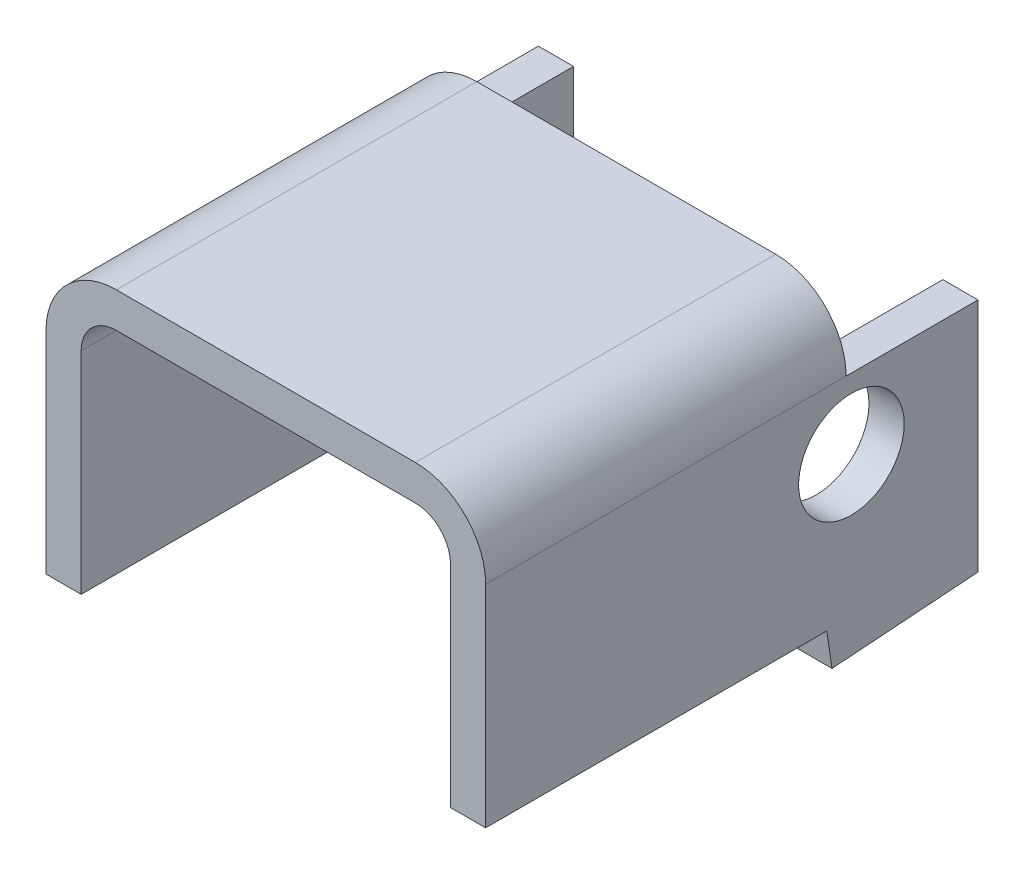
ISO-10303-21;
HEADER;
FILE_DESCRIPTION(('STEP AP214'),'2;1');
FILE_NAME('part.step','',(''),(''),'','','');
FILE_SCHEMA(('AUTOMOTIVE_DESIGN { 1 0 10303 214 1 1 1 1 }'));
ENDSEC;
DATA;
#1=APPLICATION_CONTEXT('core data for automotive mechanical design processes');
#2=APPLICATION_PROTOCOL_DEFINITION('international standard','automotive_design',2000,#1);
#3=PRODUCT_CONTEXT('',#1,'mechanical');
#4=PRODUCT('Part','Part','',(#3));
#5=PRODUCT_RELATED_PRODUCT_CATEGORY('part','',(#4));
#6=PRODUCT_DEFINITION_FORMATION('','',#4);
#7=PRODUCT_DEFINITION_CONTEXT('part definition',#1,'design');
#8=PRODUCT_DEFINITION('design','',#6,#7);
#9=PRODUCT_DEFINITION_SHAPE('','',#8);
#10=(LENGTH_UNIT() NAMED_UNIT(*) SI_UNIT(.MILLI.,.METRE.));
#11=(NAMED_UNIT(*) PLANE_ANGLE_UNIT() SI_UNIT($,.RADIAN.));
#12=(NAMED_UNIT(*) SI_UNIT($,.STERADIAN.) SOLID_ANGLE_UNIT());
#13=UNCERTAINTY_MEASURE_WITH_UNIT(LENGTH_MEASURE(1.E-05),#10,'distance_accuracy_value','');
#14=(GEOMETRIC_REPRESENTATION_CONTEXT(3) GLOBAL_UNCERTAINTY_ASSIGNED_CONTEXT((#13)) GLOBAL_UNIT_ASSIGNED_CONTEXT((#10,
#11,#12)) REPRESENTATION_CONTEXT('',''));
#15=CARTESIAN_POINT('',(0.,0.,0.));
#16=DIRECTION('',(0.,0.,1.));
#17=DIRECTION('',(1.,0.,0.));
#18=AXIS2_PLACEMENT_3D('',#15,#16,#17);
#19=CARTESIAN_POINT('',(-0.5,6.,0.));
#20=DIRECTION('',(0.,1.,0.));
#21=DIRECTION('',(0.,0.,1.));
#22=AXIS2_PLACEMENT_3D('',#19,#20,#21);
#23=PLANE('',#22);
#24=DIRECTION('',(0.,0.,1.));
#25=VECTOR('',#24,1.);
#26=CARTESIAN_POINT('',(-0.5,6.,0.));
#27=LINE('',#26,#25);
#28=CARTESIAN_POINT('',(-0.5,6.,-14.));
#29=VERTEX_POINT('',#28);
#30=CARTESIAN_POINT('',(-0.5,6.,-10.25));
#31=VERTEX_POINT('',#30);
#32=EDGE_CURVE('E124',#29,#31,#27,.T.);
#33=ORIENTED_EDGE('',*,*,#32,.T.);
#34=DIRECTION('',(1.,0.,0.));
#35=VECTOR('',#34,1.);
#36=CARTESIAN_POINT('',(0.5,6.,-10.25));
#37=LINE('',#36,#35);
#38=CARTESIAN_POINT('',(0.5,6.,-10.25));
#39=VERTEX_POINT('',#38);
#40=EDGE_CURVE('E246',#31,#39,#37,.T.);
#41=ORIENTED_EDGE('',*,*,#40,.T.);
#42=DIRECTION('',(0.,0.,1.));
#43=VECTOR('',#42,1.);
#44=CARTESIAN_POINT('',(0.5,6.,0.));
#45=LINE('',#44,#43);
#46=CARTESIAN_POINT('',(0.5,6.,-14.));
#47=VERTEX_POINT('',#46);
#48=EDGE_CURVE('E155',#47,#39,#45,.T.);
#49=ORIENTED_EDGE('',*,*,#48,.F.);
#50=DIRECTION('',(1.,0.,0.));
#51=VECTOR('',#50,1.);
#52=CARTESIAN_POINT('',(-0.5,6.,-14.));
#53=LINE('',#52,#51);
#54=EDGE_CURVE('E50',#29,#47,#53,.T.);
#55=ORIENTED_EDGE('',*,*,#54,.F.);
#56=EDGE_LOOP('',(#33,#41,#49,#55));
#57=FACE_BOUND('',#56,.T.);
#58=ADVANCED_FACE('F39',(#57),#23,.T.);
#59=CARTESIAN_POINT('',(-0.5,0.,-9.7));
#60=DIRECTION('',(0.,-1.,0.));
#61=DIRECTION('',(0.,0.,-1.));
#62=AXIS2_PLACEMENT_3D('',#59,#60,#61);
#63=PLANE('',#62);
#64=DIRECTION('',(0.,0.,-1.));
#65=VECTOR('',#64,1.);
#66=CARTESIAN_POINT('',(0.5,0.,-9.7));
#67=LINE('',#66,#65);
#68=CARTESIAN_POINT('',(0.5,0.,0.));
#69=VERTEX_POINT('',#68);
#70=CARTESIAN_POINT('',(0.5,0.,-9.7));
#71=VERTEX_POINT('',#70);
#72=EDGE_CURVE('E141',#69,#71,#67,.T.);
#73=ORIENTED_EDGE('',*,*,#72,.F.);
#74=DIRECTION('',(1.,0.,0.));
#75=VECTOR('',#74,1.);
#76=CARTESIAN_POINT('',(-0.5,0.,0.));
#77=LINE('',#76,#75);
#78=CARTESIAN_POINT('',(-0.5,0.,0.));
#79=VERTEX_POINT('',#78);
#80=EDGE_CURVE('E11',#79,#69,#77,.T.);
#81=ORIENTED_EDGE('',*,*,#80,.F.);
#82=DIRECTION('',(0.,0.,-1.));
#83=VECTOR('',#82,1.);
#84=CARTESIAN_POINT('',(-0.5,0.,-9.7));
#85=LINE('',#84,#83);
#86=CARTESIAN_POINT('',(-0.5,0.,-9.7));
#87=VERTEX_POINT('',#86);
#88=EDGE_CURVE('E132',#79,#87,#85,.T.);
#89=ORIENTED_EDGE('',*,*,#88,.T.);
#90=DIRECTION('',(1.,0.,0.));
#91=VECTOR('',#90,1.);
#92=CARTESIAN_POINT('',(-0.5,0.,-9.7));
#93=LINE('',#92,#91);
#94=EDGE_CURVE('E43',#87,#71,#93,.T.);
#95=ORIENTED_EDGE('',*,*,#94,.T.);
#96=EDGE_LOOP('',(#73,#81,#89,#95));
#97=FACE_BOUND('',#96,.T.);
#98=ADVANCED_FACE('F41',(#97),#63,.T.);
#99=CARTESIAN_POINT('',(-0.5,0.,0.));
#100=DIRECTION('',(0.,0.,1.));
#101=DIRECTION('',(1.,0.,0.));
#102=AXIS2_PLACEMENT_3D('',#99,#100,#101);
#103=PLANE('',#102);
#104=DIRECTION('',(0.,-1.,0.));
#105=VECTOR('',#104,1.);
#106=CARTESIAN_POINT('',(0.5,0.,0.));
#107=LINE('',#106,#105);
#108=CARTESIAN_POINT('',(0.5,6.,0.));
#109=VERTEX_POINT('',#108);
#110=EDGE_CURVE('E159',#109,#69,#107,.T.);
#111=ORIENTED_EDGE('',*,*,#110,.F.);
#112=CARTESIAN_POINT('',(-1.5,6.,0.));
#113=DIRECTION('',(0.,0.,1.));
#114=DIRECTION('',(-1.,0.,0.));
#115=AXIS2_PLACEMENT_3D('',#112,#113,#114);
#116=CIRCLE('',#115,2.);
#117=CARTESIAN_POINT('',(-1.5,8.,0.));
#118=VERTEX_POINT('',#117);
#119=EDGE_CURVE('E82',#109,#118,#116,.T.);
#120=ORIENTED_EDGE('',*,*,#119,.T.);
#121=DIRECTION('',(-1.,0.,0.));
#122=VECTOR('',#121,1.);
#123=CARTESIAN_POINT('',(-10.,8.,0.));
#124=LINE('',#123,#122);
#125=CARTESIAN_POINT('',(-10.,8.,0.));
#126=VERTEX_POINT('',#125);
#127=EDGE_CURVE('E176',#118,#126,#124,.T.);
#128=ORIENTED_EDGE('',*,*,#127,.T.);
#129=CARTESIAN_POINT('',(-10.,6.,0.));
#130=DIRECTION('',(0.,0.,1.));
#131=DIRECTION('',(-1.,0.,0.));
#132=AXIS2_PLACEMENT_3D('',#129,#130,#131);
#133=CIRCLE('',#132,2.);
#134=CARTESIAN_POINT('',(-12.,6.,0.));
#135=VERTEX_POINT('',#134);
#136=EDGE_CURVE('E184',#126,#135,#133,.T.);
#137=ORIENTED_EDGE('',*,*,#136,.T.);
#138=DIRECTION('',(0.,1.,0.));
#139=VECTOR('',#138,1.);
#140=CARTESIAN_POINT('',(-12.,6.,0.));
#141=LINE('',#140,#139);
#142=CARTESIAN_POINT('',(-12.,0.,0.));
#143=VERTEX_POINT('',#142);
#144=EDGE_CURVE('E336',#143,#135,#141,.T.);
#145=ORIENTED_EDGE('',*,*,#144,.F.);
#146=DIRECTION('',(-1.,0.,0.));
#147=VECTOR('',#146,1.);
#148=CARTESIAN_POINT('',(-11.,0.,0.));
#149=LINE('',#148,#147);
#150=CARTESIAN_POINT('',(-11.,0.,0.));
#151=VERTEX_POINT('',#150);
#152=EDGE_CURVE('E266',#151,#143,#149,.T.);
#153=ORIENTED_EDGE('',*,*,#152,.F.);
#154=DIRECTION('',(0.,1.,0.));
#155=VECTOR('',#154,1.);
#156=CARTESIAN_POINT('',(-11.,6.,0.));
#157=LINE('',#156,#155);
#158=CARTESIAN_POINT('',(-11.,6.,0.));
#159=VERTEX_POINT('',#158);
#160=EDGE_CURVE('E397',#151,#159,#157,.T.);
#161=ORIENTED_EDGE('',*,*,#160,.T.);
#162=CARTESIAN_POINT('',(-10.,6.,0.));
#163=DIRECTION('',(0.,0.,-1.));
#164=DIRECTION('',(1.,0.,0.));
#165=AXIS2_PLACEMENT_3D('',#162,#163,#164);
#166=CIRCLE('',#165,1.);
#167=CARTESIAN_POINT('',(-10.,7.,0.));
#168=VERTEX_POINT('',#167);
#169=EDGE_CURVE('E269',#159,#168,#166,.T.);
#170=ORIENTED_EDGE('',*,*,#169,.T.);
#171=DIRECTION('',(1.,0.,0.));
#172=VECTOR('',#171,1.);
#173=CARTESIAN_POINT('',(-1.5,7.,0.));
#174=LINE('',#173,#172);
#175=CARTESIAN_POINT('',(-1.5,7.,0.));
#176=VERTEX_POINT('',#175);
#177=EDGE_CURVE('E187',#168,#176,#174,.T.);
#178=ORIENTED_EDGE('',*,*,#177,.T.);
#179=CARTESIAN_POINT('',(-1.5,6.,0.));
#180=DIRECTION('',(0.,0.,-1.));
#181=DIRECTION('',(1.,0.,0.));
#182=AXIS2_PLACEMENT_3D('',#179,#180,#181);
#183=CIRCLE('',#182,1.);
#184=CARTESIAN_POINT('',(-0.5,6.,0.));
#185=VERTEX_POINT('',#184);
#186=EDGE_CURVE('E180',#176,#185,#183,.T.);
#187=ORIENTED_EDGE('',*,*,#186,.T.);
#188=DIRECTION('',(0.,-1.,0.));
#189=VECTOR('',#188,1.);
#190=CARTESIAN_POINT('',(-0.5,0.,0.));
#191=LINE('',#190,#189);
#192=EDGE_CURVE('E138',#185,#79,#191,.T.);
#193=ORIENTED_EDGE('',*,*,#192,.T.);
#194=ORIENTED_EDGE('',*,*,#80,.T.);
#195=EDGE_LOOP('',(#111,#120,#128,#137,#145,#153,#161,#170,#178,#187,#193,#194));
#196=FACE_BOUND('',#195,.T.);
#197=ADVANCED_FACE('F170',(#196),#103,.T.);
#198=CARTESIAN_POINT('',(-0.5,6.,-14.));
#199=DIRECTION('',(0.,0.,-1.));
#200=DIRECTION('',(-1.,0.,0.));
#201=AXIS2_PLACEMENT_3D('',#198,#199,#200);
#202=PLANE('',#201);
#203=DIRECTION('',(0.,1.,0.));
#204=VECTOR('',#203,1.);
#205=CARTESIAN_POINT('',(0.5,6.,-14.));
#206=LINE('',#205,#204);
#207=CARTESIAN_POINT('',(0.5,-0.7,-14.));
#208=VERTEX_POINT('',#207);
#209=EDGE_CURVE('E109',#208,#47,#206,.T.);
#210=ORIENTED_EDGE('',*,*,#209,.F.);
#211=DIRECTION('',(1.,0.,0.));
#212=VECTOR('',#211,1.);
#213=CARTESIAN_POINT('',(-0.5,-0.7,-14.));
#214=LINE('',#213,#212);
#215=CARTESIAN_POINT('',(-0.5,-0.7,-14.));
#216=VERTEX_POINT('',#215);
#217=EDGE_CURVE('E104',#216,#208,#214,.T.);
#218=ORIENTED_EDGE('',*,*,#217,.F.);
#219=DIRECTION('',(0.,1.,0.));
#220=VECTOR('',#219,1.);
#221=CARTESIAN_POINT('',(-0.5,6.,-14.));
#222=LINE('',#221,#220);
#223=EDGE_CURVE('E107',#216,#29,#222,.T.);
#224=ORIENTED_EDGE('',*,*,#223,.T.);
#225=ORIENTED_EDGE('',*,*,#54,.T.);
#226=EDGE_LOOP('',(#210,#218,#224,#225));
#227=FACE_BOUND('',#226,.T.);
#228=ADVANCED_FACE('F106',(#227),#202,.T.);
#229=CARTESIAN_POINT('',(-0.5,-0.7,-14.));
#230=DIRECTION('',(0.,-0.997397335089342,-0.0721010121751331));
#231=DIRECTION('',(0.,0.0721010121751331,-0.997397335089342));
#232=AXIS2_PLACEMENT_3D('',#229,#230,#231);
#233=PLANE('',#232);
#234=DIRECTION('',(0.,0.0721010121751331,-0.997397335089342));
#235=VECTOR('',#234,1.);
#236=CARTESIAN_POINT('',(0.5,-0.7,-14.));
#237=LINE('',#236,#235);
#238=CARTESIAN_POINT('',(0.5,-1.,-9.85));
#239=VERTEX_POINT('',#238);
#240=EDGE_CURVE('E150',#239,#208,#237,.T.);
#241=ORIENTED_EDGE('',*,*,#240,.F.);
#242=DIRECTION('',(1.,0.,0.));
#243=VECTOR('',#242,1.);
#244=CARTESIAN_POINT('',(-0.5,-1.,-9.85));
#245=LINE('',#244,#243);
#246=CARTESIAN_POINT('',(-0.5,-1.,-9.85));
#247=VERTEX_POINT('',#246);
#248=EDGE_CURVE('E115',#247,#239,#245,.T.);
#249=ORIENTED_EDGE('',*,*,#248,.F.);
#250=DIRECTION('',(0.,0.0721010121751331,-0.997397335089342));
#251=VECTOR('',#250,1.);
#252=CARTESIAN_POINT('',(-0.5,-0.7,-14.));
#253=LINE('',#252,#251);
#254=EDGE_CURVE('E121',#247,#216,#253,.T.);
#255=ORIENTED_EDGE('',*,*,#254,.T.);
#256=ORIENTED_EDGE('',*,*,#217,.T.);
#257=EDGE_LOOP('',(#241,#249,#255,#256));
#258=FACE_BOUND('',#257,.T.);
#259=ADVANCED_FACE('F127',(#258),#233,.T.);
#260=CARTESIAN_POINT('',(-0.5,-1.,-9.85));
#261=DIRECTION('',(0.,-0.148340452930245,0.988936352868298));
#262=DIRECTION('',(0.,-0.988936352868298,-0.148340452930245));
#263=AXIS2_PLACEMENT_3D('',#260,#261,#262);
#264=PLANE('',#263);
#265=DIRECTION('',(0.,-0.988936352868298,-0.148340452930245));
#266=VECTOR('',#265,1.);
#267=CARTESIAN_POINT('',(0.5,-1.,-9.85));
#268=LINE('',#267,#266);
#269=EDGE_CURVE('E145',#71,#239,#268,.T.);
#270=ORIENTED_EDGE('',*,*,#269,.F.);
#271=ORIENTED_EDGE('',*,*,#94,.F.);
#272=DIRECTION('',(0.,-0.988936352868298,-0.148340452930245));
#273=VECTOR('',#272,1.);
#274=CARTESIAN_POINT('',(-0.5,-1.,-9.85));
#275=LINE('',#274,#273);
#276=EDGE_CURVE('E129',#87,#247,#275,.T.);
#277=ORIENTED_EDGE('',*,*,#276,.T.);
#278=ORIENTED_EDGE('',*,*,#248,.T.);
#279=EDGE_LOOP('',(#270,#271,#277,#278));
#280=FACE_BOUND('',#279,.T.);
#281=ADVANCED_FACE('F166',(#280),#264,.T.);
#282=CARTESIAN_POINT('',(-0.5,0.,0.));
#283=DIRECTION('',(-1.,0.,0.));
#284=DIRECTION('',(0.,0.,1.));
#285=AXIS2_PLACEMENT_3D('',#282,#283,#284);
#286=PLANE('',#285);
#287=CARTESIAN_POINT('',(-0.5,4.,-10.4));
#288=DIRECTION('',(1.,0.,0.));
#289=DIRECTION('',(0.,0.,-1.));
#290=AXIS2_PLACEMENT_3D('',#287,#288,#289);
#291=CIRCLE('',#290,1.5);
#292=CARTESIAN_POINT('',(-0.5,4.,-11.9));
#293=VERTEX_POINT('',#292);
#294=EDGE_CURVE('E146',#293,#293,#291,.T.);
#295=ORIENTED_EDGE('',*,*,#294,.T.);
#296=EDGE_LOOP('',(#295));
#297=FACE_BOUND('',#296,.T.);
#298=ORIENTED_EDGE('',*,*,#88,.F.);
#299=ORIENTED_EDGE('',*,*,#192,.F.);
#300=DIRECTION('',(0.,0.,1.));
#301=VECTOR('',#300,1.);
#302=CARTESIAN_POINT('',(-0.5,6.,-10.25));
#303=LINE('',#302,#301);
#304=EDGE_CURVE('E212',#31,#185,#303,.T.);
#305=ORIENTED_EDGE('',*,*,#304,.F.);
#306=ORIENTED_EDGE('',*,*,#32,.F.);
#307=ORIENTED_EDGE('',*,*,#223,.F.);
#308=ORIENTED_EDGE('',*,*,#254,.F.);
#309=ORIENTED_EDGE('',*,*,#276,.F.);
#310=EDGE_LOOP('',(#298,#299,#305,#306,#307,#308,#309));
#311=FACE_BOUND('',#310,.T.);
#312=ADVANCED_FACE('F120',(#297,#311),#286,.T.);
#313=CARTESIAN_POINT('',(0.5,0.,0.));
#314=DIRECTION('',(-1.,0.,0.));
#315=DIRECTION('',(0.,0.,1.));
#316=AXIS2_PLACEMENT_3D('',#313,#314,#315);
#317=PLANE('',#316);
#318=CARTESIAN_POINT('',(0.5,4.,-10.4));
#319=DIRECTION('',(1.,0.,0.));
#320=DIRECTION('',(0.,0.,-1.));
#321=AXIS2_PLACEMENT_3D('',#318,#319,#320);
#322=CIRCLE('',#321,1.5);
#323=CARTESIAN_POINT('',(0.5,4.,-11.9));
#324=VERTEX_POINT('',#323);
#325=EDGE_CURVE('E198',#324,#324,#322,.T.);
#326=ORIENTED_EDGE('',*,*,#325,.F.);
#327=EDGE_LOOP('',(#326));
#328=FACE_BOUND('',#327,.T.);
#329=ORIENTED_EDGE('',*,*,#72,.T.);
#330=ORIENTED_EDGE('',*,*,#269,.T.);
#331=ORIENTED_EDGE('',*,*,#240,.T.);
#332=ORIENTED_EDGE('',*,*,#209,.T.);
#333=ORIENTED_EDGE('',*,*,#48,.T.);
#334=DIRECTION('',(0.,0.,1.));
#335=VECTOR('',#334,1.);
#336=CARTESIAN_POINT('',(0.5,6.,-10.25));
#337=LINE('',#336,#335);
#338=EDGE_CURVE('E169',#39,#109,#337,.T.);
#339=ORIENTED_EDGE('',*,*,#338,.T.);
#340=ORIENTED_EDGE('',*,*,#110,.T.);
#341=EDGE_LOOP('',(#329,#330,#331,#332,#333,#339,#340));
#342=FACE_BOUND('',#341,.T.);
#343=ADVANCED_FACE('F168',(#328,#342),#317,.F.);
#344=CARTESIAN_POINT('',(-0.5,4.,-10.4));
#345=DIRECTION('',(1.,0.,0.));
#346=DIRECTION('',(0.,0.,-1.));
#347=AXIS2_PLACEMENT_3D('',#344,#345,#346);
#348=CYLINDRICAL_SURFACE('',#347,1.5);
#349=ORIENTED_EDGE('',*,*,#294,.F.);
#350=EDGE_LOOP('',(#349));
#351=FACE_BOUND('',#350,.T.);
#352=ORIENTED_EDGE('',*,*,#325,.T.);
#353=EDGE_LOOP('',(#352));
#354=FACE_BOUND('',#353,.T.);
#355=ADVANCED_FACE('F448',(#351,#354),#348,.F.);
#356=CARTESIAN_POINT('',(-10.,6.,-10.25));
#357=DIRECTION('',(0.,0.,1.));
#358=DIRECTION('',(1.,0.,0.));
#359=AXIS2_PLACEMENT_3D('',#356,#357,#358);
#360=CYLINDRICAL_SURFACE('',#359,1.);
#361=ORIENTED_EDGE('',*,*,#169,.F.);
#362=DIRECTION('',(0.,0.,1.));
#363=VECTOR('',#362,1.);
#364=CARTESIAN_POINT('',(-11.,6.,-10.25));
#365=LINE('',#364,#363);
#366=CARTESIAN_POINT('',(-10.9999999999999,6.,-10.25));
#367=VERTEX_POINT('',#366);
#368=EDGE_CURVE('E194',#367,#159,#365,.T.);
#369=ORIENTED_EDGE('',*,*,#368,.F.);
#370=CARTESIAN_POINT('',(-10.,6.,-10.25));
#371=DIRECTION('',(0.,0.,-1.));
#372=DIRECTION('',(1.,0.,0.));
#373=AXIS2_PLACEMENT_3D('',#370,#371,#372);
#374=CIRCLE('',#373,1.);
#375=CARTESIAN_POINT('',(-10.,7.,-10.25));
#376=VERTEX_POINT('',#375);
#377=EDGE_CURVE('E193',#367,#376,#374,.T.);
#378=ORIENTED_EDGE('',*,*,#377,.T.);
#379=DIRECTION('',(0.,0.,1.));
#380=VECTOR('',#379,1.);
#381=CARTESIAN_POINT('',(-10.,7.,-10.25));
#382=LINE('',#381,#380);
#383=EDGE_CURVE('E220',#376,#168,#382,.T.);
#384=ORIENTED_EDGE('',*,*,#383,.T.);
#385=EDGE_LOOP('',(#361,#369,#378,#384));
#386=FACE_BOUND('',#385,.T.);
#387=ADVANCED_FACE('F453',(#386),#360,.F.);
#388=CARTESIAN_POINT('',(-10.,6.,-10.25));
#389=DIRECTION('',(0.,0.,1.));
#390=DIRECTION('',(1.,0.,0.));
#391=AXIS2_PLACEMENT_3D('',#388,#389,#390);
#392=CYLINDRICAL_SURFACE('',#391,2.);
#393=ORIENTED_EDGE('',*,*,#136,.F.);
#394=DIRECTION('',(0.,0.,1.));
#395=VECTOR('',#394,1.);
#396=CARTESIAN_POINT('',(-10.,8.,-10.25));
#397=LINE('',#396,#395);
#398=CARTESIAN_POINT('',(-10.,8.,-10.25));
#399=VERTEX_POINT('',#398);
#400=EDGE_CURVE('E203',#399,#126,#397,.T.);
#401=ORIENTED_EDGE('',*,*,#400,.F.);
#402=CARTESIAN_POINT('',(-10.,6.,-10.25));
#403=DIRECTION('',(0.,0.,1.));
#404=DIRECTION('',(-1.,0.,0.));
#405=AXIS2_PLACEMENT_3D('',#402,#403,#404);
#406=CIRCLE('',#405,2.);
#407=CARTESIAN_POINT('',(-12.,6.,-10.25));
#408=VERTEX_POINT('',#407);
#409=EDGE_CURVE('E234',#399,#408,#406,.T.);
#410=ORIENTED_EDGE('',*,*,#409,.T.);
#411=DIRECTION('',(0.,0.,1.));
#412=VECTOR('',#411,1.);
#413=CARTESIAN_POINT('',(-12.,6.,-10.25));
#414=LINE('',#413,#412);
#415=EDGE_CURVE('E199',#408,#135,#414,.T.);
#416=ORIENTED_EDGE('',*,*,#415,.T.);
#417=EDGE_LOOP('',(#393,#401,#410,#416));
#418=FACE_BOUND('',#417,.T.);
#419=ADVANCED_FACE('F316',(#418),#392,.T.);
#420=CARTESIAN_POINT('',(-10.,8.,-10.25));
#421=DIRECTION('',(0.,1.,0.));
#422=DIRECTION('',(-1.,0.,0.));
#423=AXIS2_PLACEMENT_3D('',#420,#421,#422);
#424=PLANE('',#423);
#425=ORIENTED_EDGE('',*,*,#127,.F.);
#426=DIRECTION('',(0.,0.,1.));
#427=VECTOR('',#426,1.);
#428=CARTESIAN_POINT('',(-1.5,8.,-10.25));
#429=LINE('',#428,#427);
#430=CARTESIAN_POINT('',(-1.5,8.,-10.25));
#431=VERTEX_POINT('',#430);
#432=EDGE_CURVE('E207',#431,#118,#429,.T.);
#433=ORIENTED_EDGE('',*,*,#432,.F.);
#434=DIRECTION('',(-1.,0.,0.));
#435=VECTOR('',#434,1.);
#436=CARTESIAN_POINT('',(-10.,8.,-10.25));
#437=LINE('',#436,#435);
#438=EDGE_CURVE('E238',#431,#399,#437,.T.);
#439=ORIENTED_EDGE('',*,*,#438,.T.);
#440=ORIENTED_EDGE('',*,*,#400,.T.);
#441=EDGE_LOOP('',(#425,#433,#439,#440));
#442=FACE_BOUND('',#441,.T.);
#443=ADVANCED_FACE('F466',(#442),#424,.T.);
#444=CARTESIAN_POINT('',(-1.5,6.,-10.25));
#445=DIRECTION('',(0.,0.,1.));
#446=DIRECTION('',(1.,0.,0.));
#447=AXIS2_PLACEMENT_3D('',#444,#445,#446);
#448=CYLINDRICAL_SURFACE('',#447,2.);
#449=ORIENTED_EDGE('',*,*,#119,.F.);
#450=ORIENTED_EDGE('',*,*,#338,.F.);
#451=CARTESIAN_POINT('',(-1.5,6.,-10.25));
#452=DIRECTION('',(0.,0.,1.));
#453=DIRECTION('',(-1.,0.,0.));
#454=AXIS2_PLACEMENT_3D('',#451,#452,#453);
#455=CIRCLE('',#454,2.);
#456=EDGE_CURVE('E242',#39,#431,#455,.T.);
#457=ORIENTED_EDGE('',*,*,#456,.T.);
#458=ORIENTED_EDGE('',*,*,#432,.T.);
#459=EDGE_LOOP('',(#449,#450,#457,#458));
#460=FACE_BOUND('',#459,.T.);
#461=ADVANCED_FACE('F462',(#460),#448,.T.);
#462=CARTESIAN_POINT('',(-1.5,6.,-10.25));
#463=DIRECTION('',(0.,0.,1.));
#464=DIRECTION('',(1.,0.,0.));
#465=AXIS2_PLACEMENT_3D('',#462,#463,#464);
#466=CYLINDRICAL_SURFACE('',#465,1.);
#467=ORIENTED_EDGE('',*,*,#186,.F.);
#468=DIRECTION('',(0.,0.,1.));
#469=VECTOR('',#468,1.);
#470=CARTESIAN_POINT('',(-1.5,7.,-10.25));
#471=LINE('',#470,#469);
#472=CARTESIAN_POINT('',(-1.5,7.,-10.25));
#473=VERTEX_POINT('',#472);
#474=EDGE_CURVE('E216',#473,#176,#471,.T.);
#475=ORIENTED_EDGE('',*,*,#474,.F.);
#476=CARTESIAN_POINT('',(-1.5,6.,-10.25));
#477=DIRECTION('',(0.,0.,-1.));
#478=DIRECTION('',(1.,0.,0.));
#479=AXIS2_PLACEMENT_3D('',#476,#477,#478);
#480=CIRCLE('',#479,1.);
#481=EDGE_CURVE('E250',#473,#31,#480,.T.);
#482=ORIENTED_EDGE('',*,*,#481,.T.);
#483=ORIENTED_EDGE('',*,*,#304,.T.);
#484=EDGE_LOOP('',(#467,#475,#482,#483));
#485=FACE_BOUND('',#484,.T.);
#486=ADVANCED_FACE('F459',(#485),#466,.F.);
#487=CARTESIAN_POINT('',(-1.5,7.,-10.25));
#488=DIRECTION('',(0.,-1.,0.));
#489=DIRECTION('',(1.,0.,0.));
#490=AXIS2_PLACEMENT_3D('',#487,#488,#489);
#491=PLANE('',#490);
#492=ORIENTED_EDGE('',*,*,#177,.F.);
#493=ORIENTED_EDGE('',*,*,#383,.F.);
#494=DIRECTION('',(1.,0.,0.));
#495=VECTOR('',#494,1.);
#496=CARTESIAN_POINT('',(-1.5,7.,-10.25));
#497=LINE('',#496,#495);
#498=EDGE_CURVE('E254',#376,#473,#497,.T.);
#499=ORIENTED_EDGE('',*,*,#498,.T.);
#500=ORIENTED_EDGE('',*,*,#474,.T.);
#501=EDGE_LOOP('',(#492,#493,#499,#500));
#502=FACE_BOUND('',#501,.T.);
#503=ADVANCED_FACE('F285',(#502),#491,.T.);
#504=CARTESIAN_POINT('',(-10.,6.,-10.25));
#505=DIRECTION('',(0.,0.,1.));
#506=DIRECTION('',(1.,0.,0.));
#507=AXIS2_PLACEMENT_3D('',#504,#505,#506);
#508=PLANE('',#507);
#509=ORIENTED_EDGE('',*,*,#377,.F.);
#510=DIRECTION('',(1.,0.,0.));
#511=VECTOR('',#510,1.);
#512=CARTESIAN_POINT('',(-11.,6.,-10.25));
#513=LINE('',#512,#511);
#514=EDGE_CURVE('E224',#408,#367,#513,.T.);
#515=ORIENTED_EDGE('',*,*,#514,.F.);
#516=ORIENTED_EDGE('',*,*,#409,.F.);
#517=ORIENTED_EDGE('',*,*,#438,.F.);
#518=ORIENTED_EDGE('',*,*,#456,.F.);
#519=ORIENTED_EDGE('',*,*,#40,.F.);
#520=ORIENTED_EDGE('',*,*,#481,.F.);
#521=ORIENTED_EDGE('',*,*,#498,.F.);
#522=EDGE_LOOP('',(#509,#515,#516,#517,#518,#519,#520,#521));
#523=FACE_BOUND('',#522,.T.);
#524=ADVANCED_FACE('F320',(#523),#508,.F.);
#525=CARTESIAN_POINT('',(-10.9999999999999,6.,-14.0000000000001));
#526=DIRECTION('',(0.,1.,0.));
#527=DIRECTION('',(0.,0.,1.));
#528=AXIS2_PLACEMENT_3D('',#525,#526,#527);
#529=PLANE('',#528);
#530=ORIENTED_EDGE('',*,*,#514,.T.);
#531=DIRECTION('',(0.,0.,-1.));
#532=VECTOR('',#531,1.);
#533=CARTESIAN_POINT('',(-10.9999999999999,6.,-14.0000000000001));
#534=LINE('',#533,#532);
#535=CARTESIAN_POINT('',(-10.9999999999999,6.,-14.0000000000001));
#536=VERTEX_POINT('',#535);
#537=EDGE_CURVE('E394',#367,#536,#534,.T.);
#538=ORIENTED_EDGE('',*,*,#537,.T.);
#539=DIRECTION('',(-1.,0.,0.));
#540=VECTOR('',#539,1.);
#541=CARTESIAN_POINT('',(-10.9999999999999,6.,-14.0000000000001));
#542=LINE('',#541,#540);
#543=CARTESIAN_POINT('',(-11.9999999999999,6.,-14.0000000000001));
#544=VERTEX_POINT('',#543);
#545=EDGE_CURVE('E330',#536,#544,#542,.T.);
#546=ORIENTED_EDGE('',*,*,#545,.T.);
#547=DIRECTION('',(0.,0.,-1.));
#548=VECTOR('',#547,1.);
#549=CARTESIAN_POINT('',(-11.9999999999999,6.,-14.0000000000001));
#550=LINE('',#549,#548);
#551=EDGE_CURVE('E326',#408,#544,#550,.T.);
#552=ORIENTED_EDGE('',*,*,#551,.F.);
#553=EDGE_LOOP('',(#530,#538,#546,#552));
#554=FACE_BOUND('',#553,.T.);
#555=ADVANCED_FACE('F327',(#554),#529,.T.);
#556=CARTESIAN_POINT('',(-11.,0.,0.));
#557=DIRECTION('',(0.,-1.,0.));
#558=DIRECTION('',(0.,0.,-1.));
#559=AXIS2_PLACEMENT_3D('',#556,#557,#558);
#560=PLANE('',#559);
#561=DIRECTION('',(0.,0.,1.));
#562=VECTOR('',#561,1.);
#563=CARTESIAN_POINT('',(-12.,0.,0.));
#564=LINE('',#563,#562);
#565=CARTESIAN_POINT('',(-11.9999999999999,0.,-9.70000000000008));
#566=VERTEX_POINT('',#565);
#567=EDGE_CURVE('E345',#566,#143,#564,.T.);
#568=ORIENTED_EDGE('',*,*,#567,.F.);
#569=DIRECTION('',(-1.,0.,0.));
#570=VECTOR('',#569,1.);
#571=CARTESIAN_POINT('',(-10.9999999999999,0.,-9.70000000000007));
#572=LINE('',#571,#570);
#573=CARTESIAN_POINT('',(-10.9999999999999,0.,-9.70000000000007));
#574=VERTEX_POINT('',#573);
#575=EDGE_CURVE('E272',#574,#566,#572,.T.);
#576=ORIENTED_EDGE('',*,*,#575,.F.);
#577=DIRECTION('',(0.,0.,1.));
#578=VECTOR('',#577,1.);
#579=CARTESIAN_POINT('',(-11.,0.,0.));
#580=LINE('',#579,#578);
#581=EDGE_CURVE('E363',#574,#151,#580,.T.);
#582=ORIENTED_EDGE('',*,*,#581,.T.);
#583=ORIENTED_EDGE('',*,*,#152,.T.);
#584=EDGE_LOOP('',(#568,#576,#582,#583));
#585=FACE_BOUND('',#584,.T.);
#586=ADVANCED_FACE('F474',(#585),#560,.T.);
#587=CARTESIAN_POINT('',(-10.9999999999999,0.,-9.70000000000007));
#588=DIRECTION('',(0.,-0.148340452930245,0.988936352868298));
#589=DIRECTION('',(0.,-0.988936352868298,-0.148340452930245));
#590=AXIS2_PLACEMENT_3D('',#587,#588,#589);
#591=PLANE('',#590);
#592=DIRECTION('',(0.,0.988936352868298,0.148340452930245));
#593=VECTOR('',#592,1.);
#594=CARTESIAN_POINT('',(-11.9999999999999,0.,-9.70000000000008));
#595=LINE('',#594,#593);
#596=CARTESIAN_POINT('',(-11.9999999999999,-1.,-9.85000000000008));
#597=VERTEX_POINT('',#596);
#598=EDGE_CURVE('E360',#597,#566,#595,.T.);
#599=ORIENTED_EDGE('',*,*,#598,.F.);
#600=DIRECTION('',(-1.,0.,0.));
#601=VECTOR('',#600,1.);
#602=CARTESIAN_POINT('',(-10.9999999999999,-1.,-9.85000000000007));
#603=LINE('',#602,#601);
#604=CARTESIAN_POINT('',(-10.9999999999999,-1.,-9.85000000000007));
#605=VERTEX_POINT('',#604);
#606=EDGE_CURVE('E367',#605,#597,#603,.T.);
#607=ORIENTED_EDGE('',*,*,#606,.F.);
#608=DIRECTION('',(0.,0.988936352868298,0.148340452930245));
#609=VECTOR('',#608,1.);
#610=CARTESIAN_POINT('',(-10.9999999999999,0.,-9.70000000000007));
#611=LINE('',#610,#609);
#612=EDGE_CURVE('E377',#605,#574,#611,.T.);
#613=ORIENTED_EDGE('',*,*,#612,.T.);
#614=ORIENTED_EDGE('',*,*,#575,.T.);
#615=EDGE_LOOP('',(#599,#607,#613,#614));
#616=FACE_BOUND('',#615,.T.);
#617=ADVANCED_FACE('F477',(#616),#591,.T.);
#618=CARTESIAN_POINT('',(-10.9999999999999,-1.,-9.85000000000007));
#619=DIRECTION('',(0.,-0.997397335089342,-0.0721010121751331));
#620=DIRECTION('',(0.,0.0721010121751331,-0.997397335089342));
#621=AXIS2_PLACEMENT_3D('',#618,#619,#620);
#622=PLANE('',#621);
#623=DIRECTION('',(0.,-0.0721010121751331,0.997397335089342));
#624=VECTOR('',#623,1.);
#625=CARTESIAN_POINT('',(-11.9999999999999,-1.,-9.85000000000008));
#626=LINE('',#625,#624);
#627=CARTESIAN_POINT('',(-11.9999999999999,-0.7,-14.0000000000001));
#628=VERTEX_POINT('',#627);
#629=EDGE_CURVE('E356',#628,#597,#626,.T.);
#630=ORIENTED_EDGE('',*,*,#629,.F.);
#631=DIRECTION('',(-1.,0.,0.));
#632=VECTOR('',#631,1.);
#633=CARTESIAN_POINT('',(-10.9999999999999,-0.7,-14.0000000000001));
#634=LINE('',#633,#632);
#635=CARTESIAN_POINT('',(-10.9999999999999,-0.7,-14.0000000000001));
#636=VERTEX_POINT('',#635);
#637=EDGE_CURVE('E371',#636,#628,#634,.T.);
#638=ORIENTED_EDGE('',*,*,#637,.F.);
#639=DIRECTION('',(0.,-0.0721010121751331,0.997397335089342));
#640=VECTOR('',#639,1.);
#641=CARTESIAN_POINT('',(-10.9999999999999,-1.,-9.85000000000007));
#642=LINE('',#641,#640);
#643=EDGE_CURVE('E382',#636,#605,#642,.T.);
#644=ORIENTED_EDGE('',*,*,#643,.T.);
#645=ORIENTED_EDGE('',*,*,#606,.T.);
#646=EDGE_LOOP('',(#630,#638,#644,#645));
#647=FACE_BOUND('',#646,.T.);
#648=ADVANCED_FACE('F482',(#647),#622,.T.);
#649=CARTESIAN_POINT('',(-10.9999999999999,-0.7,-14.0000000000001));
#650=DIRECTION('',(0.,0.,-1.));
#651=DIRECTION('',(-1.,0.,0.));
#652=AXIS2_PLACEMENT_3D('',#649,#650,#651);
#653=PLANE('',#652);
#654=DIRECTION('',(0.,-1.,0.));
#655=VECTOR('',#654,1.);
#656=CARTESIAN_POINT('',(-11.9999999999999,-0.7,-14.0000000000001));
#657=LINE('',#656,#655);
#658=EDGE_CURVE('E335',#544,#628,#657,.T.);
#659=ORIENTED_EDGE('',*,*,#658,.F.);
#660=ORIENTED_EDGE('',*,*,#545,.F.);
#661=DIRECTION('',(0.,-1.,0.));
#662=VECTOR('',#661,1.);
#663=CARTESIAN_POINT('',(-10.9999999999999,-0.7,-14.0000000000001));
#664=LINE('',#663,#662);
#665=EDGE_CURVE('E388',#536,#636,#664,.T.);
#666=ORIENTED_EDGE('',*,*,#665,.T.);
#667=ORIENTED_EDGE('',*,*,#637,.T.);
#668=EDGE_LOOP('',(#659,#660,#666,#667));
#669=FACE_BOUND('',#668,.T.);
#670=ADVANCED_FACE('F424',(#669),#653,.T.);
#671=CARTESIAN_POINT('',(-11.,0.,0.));
#672=DIRECTION('',(1.,0.,0.));
#673=DIRECTION('',(0.,0.,-1.));
#674=AXIS2_PLACEMENT_3D('',#671,#672,#673);
#675=PLANE('',#674);
#676=CARTESIAN_POINT('',(-10.9999999999999,4.,-10.4000000000001));
#677=DIRECTION('',(-1.,0.,0.));
#678=DIRECTION('',(0.,0.,1.));
#679=AXIS2_PLACEMENT_3D('',#676,#677,#678);
#680=CIRCLE('',#679,1.50000000000003);
#681=CARTESIAN_POINT('',(-10.9999999999999,4.,-8.90000000000004));
#682=VERTEX_POINT('',#681);
#683=EDGE_CURVE('E350',#682,#682,#680,.T.);
#684=ORIENTED_EDGE('',*,*,#683,.T.);
#685=EDGE_LOOP('',(#684));
#686=FACE_BOUND('',#685,.T.);
#687=ORIENTED_EDGE('',*,*,#581,.F.);
#688=ORIENTED_EDGE('',*,*,#612,.F.);
#689=ORIENTED_EDGE('',*,*,#643,.F.);
#690=ORIENTED_EDGE('',*,*,#665,.F.);
#691=ORIENTED_EDGE('',*,*,#537,.F.);
#692=ORIENTED_EDGE('',*,*,#368,.T.);
#693=ORIENTED_EDGE('',*,*,#160,.F.);
#694=EDGE_LOOP('',(#687,#688,#689,#690,#691,#692,#693));
#695=FACE_BOUND('',#694,.T.);
#696=ADVANCED_FACE('F410',(#686,#695),#675,.T.);
#697=CARTESIAN_POINT('',(-12.,0.,0.));
#698=DIRECTION('',(1.,0.,0.));
#699=DIRECTION('',(0.,0.,-1.));
#700=AXIS2_PLACEMENT_3D('',#697,#698,#699);
#701=PLANE('',#700);
#702=CARTESIAN_POINT('',(-11.9999999999999,4.,-10.4000000000001));
#703=DIRECTION('',(-1.,0.,0.));
#704=DIRECTION('',(0.,0.,1.));
#705=AXIS2_PLACEMENT_3D('',#702,#703,#704);
#706=CIRCLE('',#705,1.50000000000003);
#707=CARTESIAN_POINT('',(-11.9999999999999,4.,-8.90000000000004));
#708=VERTEX_POINT('',#707);
#709=EDGE_CURVE('E402',#708,#708,#706,.T.);
#710=ORIENTED_EDGE('',*,*,#709,.F.);
#711=EDGE_LOOP('',(#710));
#712=FACE_BOUND('',#711,.T.);
#713=ORIENTED_EDGE('',*,*,#567,.T.);
#714=ORIENTED_EDGE('',*,*,#144,.T.);
#715=ORIENTED_EDGE('',*,*,#415,.F.);
#716=ORIENTED_EDGE('',*,*,#551,.T.);
#717=ORIENTED_EDGE('',*,*,#658,.T.);
#718=ORIENTED_EDGE('',*,*,#629,.T.);
#719=ORIENTED_EDGE('',*,*,#598,.T.);
#720=EDGE_LOOP('',(#713,#714,#715,#716,#717,#718,#719));
#721=FACE_BOUND('',#720,.T.);
#722=ADVANCED_FACE('F340',(#712,#721),#701,.F.);
#723=CARTESIAN_POINT('',(-10.9999999999999,4.,-10.4000000000001));
#724=DIRECTION('',(-1.,0.,0.));
#725=DIRECTION('',(0.,0.,1.));
#726=AXIS2_PLACEMENT_3D('',#723,#724,#725);
#727=CYLINDRICAL_SURFACE('',#726,1.50000000000003);
#728=ORIENTED_EDGE('',*,*,#683,.F.);
#729=EDGE_LOOP('',(#728));
#730=FACE_BOUND('',#729,.T.);
#731=ORIENTED_EDGE('',*,*,#709,.T.);
#732=EDGE_LOOP('',(#731));
#733=FACE_BOUND('',#732,.T.);
#734=ADVANCED_FACE('F413',(#730,#733),#727,.F.);
#735=CLOSED_SHELL('',(#58,#98,#197,#228,#259,#281,#312,#343,#355,#387,#419,#443,#461,#486,#503,
#524,#555,#586,#617,#648,#670,#696,#722,#734));
#736=MANIFOLD_SOLID_BREP('B2',#735);
#737=ADVANCED_BREP_SHAPE_REPRESENTATION('',(#18,#736),#14);
#738=SHAPE_DEFINITION_REPRESENTATION(#9,#737);
ENDSEC;
END-ISO-10303-21;
